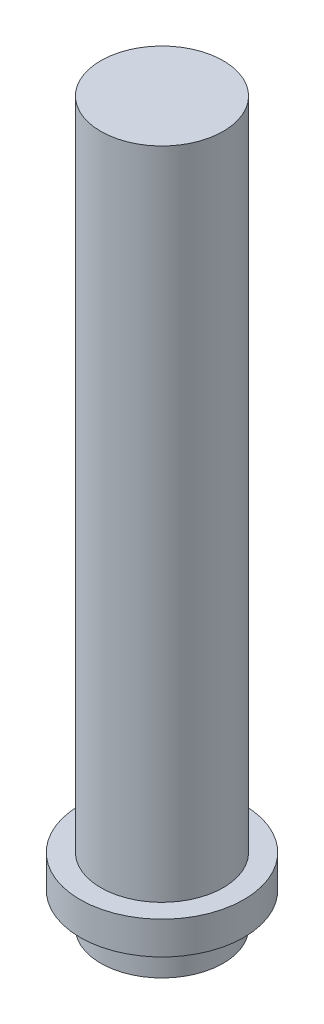
ISO-10303-21;
HEADER;
FILE_DESCRIPTION(('STEP AP214'),'2;1');
FILE_NAME('part.step','',(''),(''),'','','');
FILE_SCHEMA(('AUTOMOTIVE_DESIGN { 1 0 10303 214 1 1 1 1 }'));
ENDSEC;
DATA;
#1=APPLICATION_CONTEXT('core data for automotive mechanical design processes');
#2=APPLICATION_PROTOCOL_DEFINITION('international standard','automotive_design',2000,#1);
#3=PRODUCT_CONTEXT('',#1,'mechanical');
#4=PRODUCT('Part','Part','',(#3));
#5=PRODUCT_RELATED_PRODUCT_CATEGORY('part','',(#4));
#6=PRODUCT_DEFINITION_FORMATION('','',#4);
#7=PRODUCT_DEFINITION_CONTEXT('part definition',#1,'design');
#8=PRODUCT_DEFINITION('design','',#6,#7);
#9=PRODUCT_DEFINITION_SHAPE('','',#8);
#10=(LENGTH_UNIT() NAMED_UNIT(*) SI_UNIT(.MILLI.,.METRE.));
#11=(NAMED_UNIT(*) PLANE_ANGLE_UNIT() SI_UNIT($,.RADIAN.));
#12=(NAMED_UNIT(*) SI_UNIT($,.STERADIAN.) SOLID_ANGLE_UNIT());
#13=UNCERTAINTY_MEASURE_WITH_UNIT(LENGTH_MEASURE(1.E-05),#10,'distance_accuracy_value','');
#14=(GEOMETRIC_REPRESENTATION_CONTEXT(3) GLOBAL_UNCERTAINTY_ASSIGNED_CONTEXT((#13)) GLOBAL_UNIT_ASSIGNED_CONTEXT((#10,
#11,#12)) REPRESENTATION_CONTEXT('',''));
#15=CARTESIAN_POINT('',(0.,0.,0.));
#16=DIRECTION('',(0.,0.,1.));
#17=DIRECTION('',(1.,0.,0.));
#18=AXIS2_PLACEMENT_3D('',#15,#16,#17);
#19=CARTESIAN_POINT('',(0.,2.54,0.));
#20=DIRECTION('',(0.,-1.,0.));
#21=DIRECTION('',(0.,0.,-1.));
#22=AXIS2_PLACEMENT_3D('',#19,#20,#21);
#23=CYLINDRICAL_SURFACE('',#22,6.35);
#24=CARTESIAN_POINT('',(0.,2.54,0.));
#25=DIRECTION('',(0.,1.,0.));
#26=DIRECTION('',(0.,0.,1.));
#27=AXIS2_PLACEMENT_3D('',#24,#25,#26);
#28=CIRCLE('',#27,6.35);
#29=CARTESIAN_POINT('',(0.,2.54,6.35));
#30=VERTEX_POINT('',#29);
#31=EDGE_CURVE('E45',#30,#30,#28,.T.);
#32=ORIENTED_EDGE('',*,*,#31,.F.);
#33=EDGE_LOOP('',(#32));
#34=FACE_BOUND('',#33,.T.);
#35=CARTESIAN_POINT('',(0.,0.,0.));
#36=DIRECTION('',(0.,1.,0.));
#37=DIRECTION('',(0.,0.,1.));
#38=AXIS2_PLACEMENT_3D('',#35,#36,#37);
#39=CIRCLE('',#38,6.35);
#40=CARTESIAN_POINT('',(0.,0.,6.35));
#41=VERTEX_POINT('',#40);
#42=EDGE_CURVE('E36',#41,#41,#39,.T.);
#43=ORIENTED_EDGE('',*,*,#42,.T.);
#44=EDGE_LOOP('',(#43));
#45=FACE_BOUND('',#44,.T.);
#46=ADVANCED_FACE('F33',(#34,#45),#23,.T.);
#47=CARTESIAN_POINT('',(0.,2.54,0.));
#48=DIRECTION('',(0.,1.,0.));
#49=DIRECTION('',(0.,0.,1.));
#50=AXIS2_PLACEMENT_3D('',#47,#48,#49);
#51=PLANE('',#50);
#52=CARTESIAN_POINT('',(0.,2.54,0.));
#53=DIRECTION('',(0.,1.,0.));
#54=DIRECTION('',(0.,0.,1.));
#55=AXIS2_PLACEMENT_3D('',#52,#53,#54);
#56=CIRCLE('',#55,4.7498);
#57=CARTESIAN_POINT('',(0.,2.54,4.7498));
#58=VERTEX_POINT('',#57);
#59=EDGE_CURVE('E40',#58,#58,#56,.T.);
#60=ORIENTED_EDGE('',*,*,#59,.F.);
#61=EDGE_LOOP('',(#60));
#62=FACE_BOUND('',#61,.T.);
#63=ORIENTED_EDGE('',*,*,#31,.T.);
#64=EDGE_LOOP('',(#63));
#65=FACE_BOUND('',#64,.T.);
#66=ADVANCED_FACE('F62',(#62,#65),#51,.T.);
#67=CARTESIAN_POINT('',(0.,0.,0.));
#68=DIRECTION('',(0.,1.,0.));
#69=DIRECTION('',(0.,0.,1.));
#70=AXIS2_PLACEMENT_3D('',#67,#68,#69);
#71=PLANE('',#70);
#72=CARTESIAN_POINT('',(0.,0.,0.));
#73=DIRECTION('',(0.,-1.,0.));
#74=DIRECTION('',(0.,0.,-1.));
#75=AXIS2_PLACEMENT_3D('',#72,#73,#74);
#76=CIRCLE('',#75,4.7498);
#77=CARTESIAN_POINT('',(0.,0.,-4.7498));
#78=VERTEX_POINT('',#77);
#79=EDGE_CURVE('E10',#78,#78,#76,.T.);
#80=ORIENTED_EDGE('',*,*,#79,.F.);
#81=EDGE_LOOP('',(#80));
#82=FACE_BOUND('',#81,.T.);
#83=ORIENTED_EDGE('',*,*,#42,.F.);
#84=EDGE_LOOP('',(#83));
#85=FACE_BOUND('',#84,.T.);
#86=ADVANCED_FACE('F59',(#82,#85),#71,.F.);
#87=CARTESIAN_POINT('',(0.,53.34,0.));
#88=DIRECTION('',(0.,-1.,0.));
#89=DIRECTION('',(0.,0.,-1.));
#90=AXIS2_PLACEMENT_3D('',#87,#88,#89);
#91=CYLINDRICAL_SURFACE('',#90,4.7498);
#92=CARTESIAN_POINT('',(0.,53.34,0.));
#93=DIRECTION('',(0.,1.,0.));
#94=DIRECTION('',(0.,0.,1.));
#95=AXIS2_PLACEMENT_3D('',#92,#93,#94);
#96=CIRCLE('',#95,4.7498);
#97=CARTESIAN_POINT('',(0.,53.34,4.7498));
#98=VERTEX_POINT('',#97);
#99=EDGE_CURVE('E50',#98,#98,#96,.T.);
#100=ORIENTED_EDGE('',*,*,#99,.F.);
#101=EDGE_LOOP('',(#100));
#102=FACE_BOUND('',#101,.T.);
#103=ORIENTED_EDGE('',*,*,#59,.T.);
#104=EDGE_LOOP('',(#103));
#105=FACE_BOUND('',#104,.T.);
#106=ADVANCED_FACE('F61',(#102,#105),#91,.T.);
#107=CARTESIAN_POINT('',(0.,53.34,0.));
#108=DIRECTION('',(0.,1.,0.));
#109=DIRECTION('',(0.,0.,1.));
#110=AXIS2_PLACEMENT_3D('',#107,#108,#109);
#111=PLANE('',#110);
#112=ORIENTED_EDGE('',*,*,#99,.T.);
#113=EDGE_LOOP('',(#112));
#114=FACE_BOUND('',#113,.T.);
#115=ADVANCED_FACE('F68',(#114),#111,.T.);
#116=CARTESIAN_POINT('',(0.,-2.54,0.));
#117=DIRECTION('',(0.,1.,0.));
#118=DIRECTION('',(0.,0.,1.));
#119=AXIS2_PLACEMENT_3D('',#116,#117,#118);
#120=CYLINDRICAL_SURFACE('',#119,4.7498);
#121=CARTESIAN_POINT('',(0.,-2.54,0.));
#122=DIRECTION('',(0.,-1.,0.));
#123=DIRECTION('',(0.,0.,-1.));
#124=AXIS2_PLACEMENT_3D('',#121,#122,#123);
#125=CIRCLE('',#124,4.7498);
#126=CARTESIAN_POINT('',(0.,-2.54,-4.7498));
#127=VERTEX_POINT('',#126);
#128=EDGE_CURVE('E49',#127,#127,#125,.T.);
#129=ORIENTED_EDGE('',*,*,#128,.F.);
#130=EDGE_LOOP('',(#129));
#131=FACE_BOUND('',#130,.T.);
#132=ORIENTED_EDGE('',*,*,#79,.T.);
#133=EDGE_LOOP('',(#132));
#134=FACE_BOUND('',#133,.T.);
#135=ADVANCED_FACE('F96',(#131,#134),#120,.T.);
#136=CARTESIAN_POINT('',(0.,-2.54,0.));
#137=DIRECTION('',(0.,-1.,0.));
#138=DIRECTION('',(0.,0.,-1.));
#139=AXIS2_PLACEMENT_3D('',#136,#137,#138);
#140=PLANE('',#139);
#141=ORIENTED_EDGE('',*,*,#128,.T.);
#142=EDGE_LOOP('',(#141));
#143=FACE_BOUND('',#142,.T.);
#144=ADVANCED_FACE('F110',(#143),#140,.T.);
#145=CLOSED_SHELL('',(#46,#66,#86,#106,#115,#135,#144));
#146=MANIFOLD_SOLID_BREP('B2',#145);
#147=ADVANCED_BREP_SHAPE_REPRESENTATION('',(#18,#146),#14);
#148=SHAPE_DEFINITION_REPRESENTATION(#9,#147);
ENDSEC;
END-ISO-10303-21;
